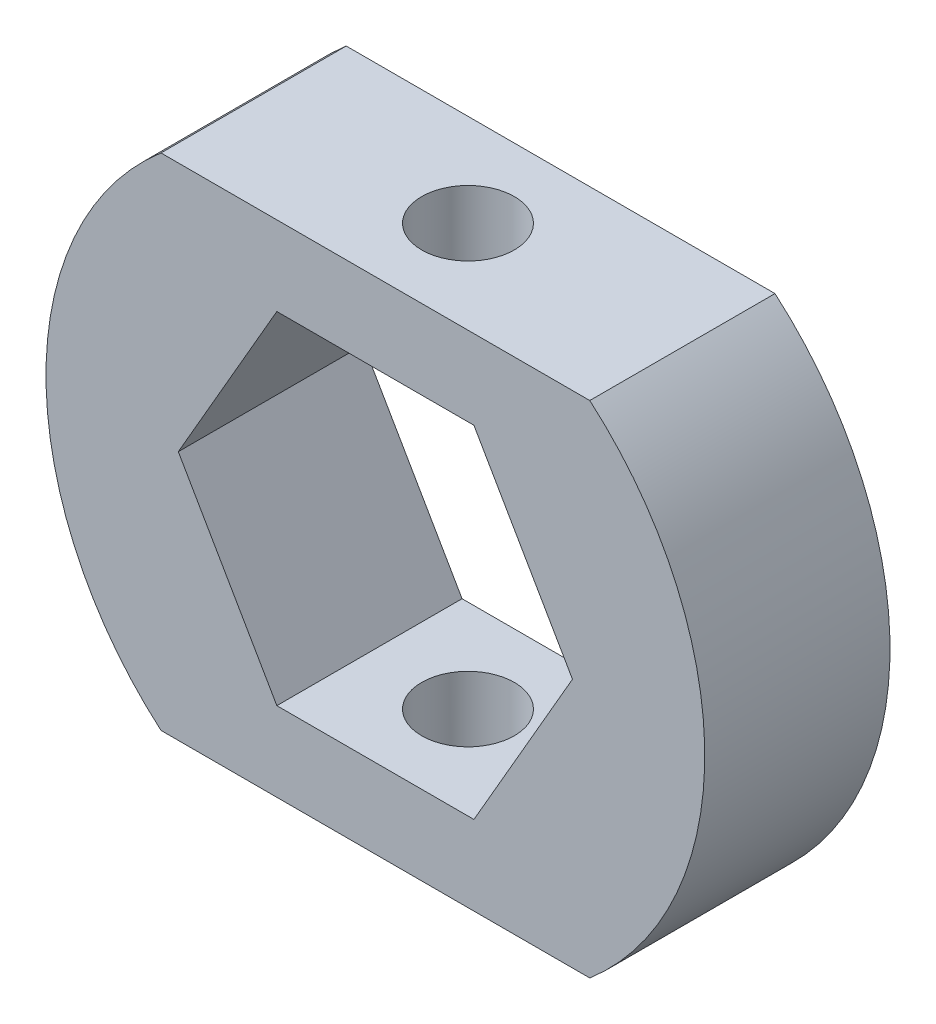
ISO-10303-21;
HEADER;
FILE_DESCRIPTION(('STEP AP214'),'2;1');
FILE_NAME('part.step','',(''),(''),'','','');
FILE_SCHEMA(('AUTOMOTIVE_DESIGN { 1 0 10303 214 1 1 1 1 }'));
ENDSEC;
DATA;
#1=APPLICATION_CONTEXT('core data for automotive mechanical design processes');
#2=APPLICATION_PROTOCOL_DEFINITION('international standard','automotive_design',2000,#1);
#3=PRODUCT_CONTEXT('',#1,'mechanical');
#4=PRODUCT('Part','Part','',(#3));
#5=PRODUCT_RELATED_PRODUCT_CATEGORY('part','',(#4));
#6=PRODUCT_DEFINITION_FORMATION('','',#4);
#7=PRODUCT_DEFINITION_CONTEXT('part definition',#1,'design');
#8=PRODUCT_DEFINITION('design','',#6,#7);
#9=PRODUCT_DEFINITION_SHAPE('','',#8);
#10=(LENGTH_UNIT() NAMED_UNIT(*) SI_UNIT(.MILLI.,.METRE.));
#11=(NAMED_UNIT(*) PLANE_ANGLE_UNIT() SI_UNIT($,.RADIAN.));
#12=(NAMED_UNIT(*) SI_UNIT($,.STERADIAN.) SOLID_ANGLE_UNIT());
#13=UNCERTAINTY_MEASURE_WITH_UNIT(LENGTH_MEASURE(1.E-05),#10,'distance_accuracy_value','');
#14=(GEOMETRIC_REPRESENTATION_CONTEXT(3) GLOBAL_UNCERTAINTY_ASSIGNED_CONTEXT((#13)) GLOBAL_UNIT_ASSIGNED_CONTEXT((#10,
#11,#12)) REPRESENTATION_CONTEXT('',''));
#15=CARTESIAN_POINT('',(0.,0.,0.));
#16=DIRECTION('',(0.,0.,1.));
#17=DIRECTION('',(1.,0.,0.));
#18=AXIS2_PLACEMENT_3D('',#15,#16,#17);
#19=CARTESIAN_POINT('',(0.,0.,3.5));
#20=DIRECTION('',(0.,0.,-1.));
#21=DIRECTION('',(-1.,0.,0.));
#22=AXIS2_PLACEMENT_3D('',#19,#20,#21);
#23=PLANE('',#22);
#24=CARTESIAN_POINT('',(0.,0.,3.5));
#25=DIRECTION('',(0.,0.,1.));
#26=DIRECTION('',(-1.,0.,0.));
#27=AXIS2_PLACEMENT_3D('',#24,#25,#26);
#28=CIRCLE('',#27,12.4478184725462);
#29=CARTESIAN_POINT('',(-8.10220246139663,9.45,3.5));
#30=VERTEX_POINT('',#29);
#31=CARTESIAN_POINT('',(-8.10220246139663,-9.45,3.5));
#32=VERTEX_POINT('',#31);
#33=EDGE_CURVE('E189',#30,#32,#28,.T.);
#34=ORIENTED_EDGE('',*,*,#33,.T.);
#35=DIRECTION('',(1.,0.,0.));
#36=VECTOR('',#35,1.);
#37=CARTESIAN_POINT('',(8.10220246139663,-9.45,3.5));
#38=LINE('',#37,#36);
#39=CARTESIAN_POINT('',(8.10220246139663,-9.45,3.5));
#40=VERTEX_POINT('',#39);
#41=EDGE_CURVE('E193',#32,#40,#38,.T.);
#42=ORIENTED_EDGE('',*,*,#41,.T.);
#43=CARTESIAN_POINT('',(0.,0.,3.5));
#44=DIRECTION('',(0.,0.,1.));
#45=DIRECTION('',(-1.,0.,0.));
#46=AXIS2_PLACEMENT_3D('',#43,#44,#45);
#47=CIRCLE('',#46,12.4478184725462);
#48=CARTESIAN_POINT('',(8.10220246139663,9.45,3.5));
#49=VERTEX_POINT('',#48);
#50=EDGE_CURVE('E197',#40,#49,#47,.T.);
#51=ORIENTED_EDGE('',*,*,#50,.T.);
#52=DIRECTION('',(-1.,0.,0.));
#53=VECTOR('',#52,1.);
#54=CARTESIAN_POINT('',(-8.10220246139663,9.45,3.5));
#55=LINE('',#54,#53);
#56=EDGE_CURVE('E200',#49,#30,#55,.T.);
#57=ORIENTED_EDGE('',*,*,#56,.T.);
#58=EDGE_LOOP('',(#34,#42,#51,#57));
#59=FACE_BOUND('',#58,.T.);
#60=DIRECTION('',(0.499999999999995,0.866025403784442,0.));
#61=VECTOR('',#60,1.);
#62=CARTESIAN_POINT('',(3.72390923627316,-6.44999999999996,3.5));
#63=LINE('',#62,#61);
#64=CARTESIAN_POINT('',(3.72390923627316,-6.44999999999996,3.5));
#65=VERTEX_POINT('',#64);
#66=CARTESIAN_POINT('',(7.44781847254618,0.,3.5));
#67=VERTEX_POINT('',#66);
#68=EDGE_CURVE('E118',#65,#67,#63,.T.);
#69=ORIENTED_EDGE('',*,*,#68,.F.);
#70=DIRECTION('',(1.,0.,0.));
#71=VECTOR('',#70,1.);
#72=CARTESIAN_POINT('',(-3.72390923627303,-6.45000000000004,3.5));
#73=LINE('',#72,#71);
#74=CARTESIAN_POINT('',(-3.72390923627303,-6.45000000000004,3.5));
#75=VERTEX_POINT('',#74);
#76=EDGE_CURVE('E154',#75,#65,#73,.T.);
#77=ORIENTED_EDGE('',*,*,#76,.F.);
#78=DIRECTION('',(0.500000000000007,-0.866025403784434,0.));
#79=VECTOR('',#78,1.);
#80=CARTESIAN_POINT('',(-7.44781847254618,0.,3.5));
#81=LINE('',#80,#79);
#82=CARTESIAN_POINT('',(-7.44781847254618,0.,3.5));
#83=VERTEX_POINT('',#82);
#84=EDGE_CURVE('E151',#83,#75,#81,.T.);
#85=ORIENTED_EDGE('',*,*,#84,.F.);
#86=DIRECTION('',(-0.499999999999995,-0.866025403784442,0.));
#87=VECTOR('',#86,1.);
#88=CARTESIAN_POINT('',(-3.72390923627312,6.44999999999999,3.5));
#89=LINE('',#88,#87);
#90=CARTESIAN_POINT('',(-3.72390923627312,6.44999999999999,3.5));
#91=VERTEX_POINT('',#90);
#92=EDGE_CURVE('E145',#91,#83,#89,.T.);
#93=ORIENTED_EDGE('',*,*,#92,.F.);
#94=DIRECTION('',(-1.,0.,0.));
#95=VECTOR('',#94,1.);
#96=CARTESIAN_POINT('',(3.72390923627307,6.45000000000001,3.5));
#97=LINE('',#96,#95);
#98=CARTESIAN_POINT('',(3.72390923627307,6.45000000000001,3.5));
#99=VERTEX_POINT('',#98);
#100=EDGE_CURVE('E141',#99,#91,#97,.T.);
#101=ORIENTED_EDGE('',*,*,#100,.F.);
#102=DIRECTION('',(-0.500000000000001,0.866025403784438,0.));
#103=VECTOR('',#102,1.);
#104=CARTESIAN_POINT('',(7.44781847254618,0.,3.5));
#105=LINE('',#104,#103);
#106=EDGE_CURVE('E127',#67,#99,#105,.T.);
#107=ORIENTED_EDGE('',*,*,#106,.F.);
#108=EDGE_LOOP('',(#69,#77,#85,#93,#101,#107));
#109=FACE_BOUND('',#108,.T.);
#110=ADVANCED_FACE('F39',(#59,#109),#23,.F.);
#111=CARTESIAN_POINT('',(0.,0.,-3.5));
#112=DIRECTION('',(0.,0.,-1.));
#113=DIRECTION('',(-1.,0.,0.));
#114=AXIS2_PLACEMENT_3D('',#111,#112,#113);
#115=PLANE('',#114);
#116=CARTESIAN_POINT('',(0.,0.,-3.5));
#117=DIRECTION('',(0.,0.,1.));
#118=DIRECTION('',(-1.,0.,0.));
#119=AXIS2_PLACEMENT_3D('',#116,#117,#118);
#120=CIRCLE('',#119,12.4478184725462);
#121=CARTESIAN_POINT('',(-8.10220246139663,9.45,-3.5));
#122=VERTEX_POINT('',#121);
#123=CARTESIAN_POINT('',(-8.10220246139663,-9.45,-3.5));
#124=VERTEX_POINT('',#123);
#125=EDGE_CURVE('E136',#122,#124,#120,.T.);
#126=ORIENTED_EDGE('',*,*,#125,.F.);
#127=DIRECTION('',(-1.,0.,0.));
#128=VECTOR('',#127,1.);
#129=CARTESIAN_POINT('',(-8.10220246139663,9.45,-3.5));
#130=LINE('',#129,#128);
#131=CARTESIAN_POINT('',(8.10220246139663,9.45,-3.5));
#132=VERTEX_POINT('',#131);
#133=EDGE_CURVE('E194',#132,#122,#130,.T.);
#134=ORIENTED_EDGE('',*,*,#133,.F.);
#135=CARTESIAN_POINT('',(0.,0.,-3.5));
#136=DIRECTION('',(0.,0.,1.));
#137=DIRECTION('',(-1.,0.,0.));
#138=AXIS2_PLACEMENT_3D('',#135,#136,#137);
#139=CIRCLE('',#138,12.4478184725462);
#140=CARTESIAN_POINT('',(8.10220246139663,-9.45,-3.5));
#141=VERTEX_POINT('',#140);
#142=EDGE_CURVE('E210',#141,#132,#139,.T.);
#143=ORIENTED_EDGE('',*,*,#142,.F.);
#144=DIRECTION('',(1.,0.,0.));
#145=VECTOR('',#144,1.);
#146=CARTESIAN_POINT('',(8.10220246139663,-9.45,-3.5));
#147=LINE('',#146,#145);
#148=EDGE_CURVE('E207',#124,#141,#147,.T.);
#149=ORIENTED_EDGE('',*,*,#148,.F.);
#150=EDGE_LOOP('',(#126,#134,#143,#149));
#151=FACE_BOUND('',#150,.T.);
#152=DIRECTION('',(1.,0.,0.));
#153=VECTOR('',#152,1.);
#154=CARTESIAN_POINT('',(-3.72390923627303,-6.45000000000004,-3.5));
#155=LINE('',#154,#153);
#156=CARTESIAN_POINT('',(-3.72390923627303,-6.45000000000004,-3.5));
#157=VERTEX_POINT('',#156);
#158=CARTESIAN_POINT('',(3.72390923627316,-6.44999999999996,-3.5));
#159=VERTEX_POINT('',#158);
#160=EDGE_CURVE('E128',#157,#159,#155,.T.);
#161=ORIENTED_EDGE('',*,*,#160,.T.);
#162=DIRECTION('',(0.499999999999995,0.866025403784442,0.));
#163=VECTOR('',#162,1.);
#164=CARTESIAN_POINT('',(3.72390923627316,-6.44999999999996,-3.5));
#165=LINE('',#164,#163);
#166=CARTESIAN_POINT('',(7.44781847254618,0.,-3.5));
#167=VERTEX_POINT('',#166);
#168=EDGE_CURVE('E64',#159,#167,#165,.T.);
#169=ORIENTED_EDGE('',*,*,#168,.T.);
#170=DIRECTION('',(-0.500000000000001,0.866025403784438,0.));
#171=VECTOR('',#170,1.);
#172=CARTESIAN_POINT('',(7.44781847254618,0.,-3.5));
#173=LINE('',#172,#171);
#174=CARTESIAN_POINT('',(3.72390923627307,6.45000000000001,-3.5));
#175=VERTEX_POINT('',#174);
#176=EDGE_CURVE('E134',#167,#175,#173,.T.);
#177=ORIENTED_EDGE('',*,*,#176,.T.);
#178=DIRECTION('',(-1.,0.,0.));
#179=VECTOR('',#178,1.);
#180=CARTESIAN_POINT('',(3.72390923627307,6.45000000000001,-3.5));
#181=LINE('',#180,#179);
#182=CARTESIAN_POINT('',(-3.72390923627312,6.44999999999999,-3.5));
#183=VERTEX_POINT('',#182);
#184=EDGE_CURVE('E162',#175,#183,#181,.T.);
#185=ORIENTED_EDGE('',*,*,#184,.T.);
#186=DIRECTION('',(-0.499999999999995,-0.866025403784442,0.));
#187=VECTOR('',#186,1.);
#188=CARTESIAN_POINT('',(-3.72390923627312,6.44999999999999,-3.5));
#189=LINE('',#188,#187);
#190=CARTESIAN_POINT('',(-7.44781847254618,0.,-3.5));
#191=VERTEX_POINT('',#190);
#192=EDGE_CURVE('E166',#183,#191,#189,.T.);
#193=ORIENTED_EDGE('',*,*,#192,.T.);
#194=DIRECTION('',(0.500000000000007,-0.866025403784434,0.));
#195=VECTOR('',#194,1.);
#196=CARTESIAN_POINT('',(-7.44781847254618,0.,-3.5));
#197=LINE('',#196,#195);
#198=EDGE_CURVE('E170',#191,#157,#197,.T.);
#199=ORIENTED_EDGE('',*,*,#198,.T.);
#200=EDGE_LOOP('',(#161,#169,#177,#185,#193,#199));
#201=FACE_BOUND('',#200,.T.);
#202=ADVANCED_FACE('F234',(#151,#201),#115,.T.);
#203=CARTESIAN_POINT('',(0.,0.,3.5));
#204=DIRECTION('',(0.,0.,-1.));
#205=DIRECTION('',(-1.,0.,0.));
#206=AXIS2_PLACEMENT_3D('',#203,#204,#205);
#207=CYLINDRICAL_SURFACE('',#206,12.4478184725462);
#208=ORIENTED_EDGE('',*,*,#125,.T.);
#209=DIRECTION('',(0.,0.,-1.));
#210=VECTOR('',#209,1.);
#211=CARTESIAN_POINT('',(-8.10220246139663,-9.45,3.5));
#212=LINE('',#211,#210);
#213=EDGE_CURVE('E11',#32,#124,#212,.T.);
#214=ORIENTED_EDGE('',*,*,#213,.F.);
#215=ORIENTED_EDGE('',*,*,#33,.F.);
#216=DIRECTION('',(0.,0.,-1.));
#217=VECTOR('',#216,1.);
#218=CARTESIAN_POINT('',(-8.10220246139663,9.45,3.5));
#219=LINE('',#218,#217);
#220=EDGE_CURVE('E203',#30,#122,#219,.T.);
#221=ORIENTED_EDGE('',*,*,#220,.T.);
#222=EDGE_LOOP('',(#208,#214,#215,#221));
#223=FACE_BOUND('',#222,.T.);
#224=ADVANCED_FACE('F41',(#223),#207,.T.);
#225=CARTESIAN_POINT('',(8.10220246139663,-9.45,3.5));
#226=DIRECTION('',(0.,1.,0.));
#227=DIRECTION('',(0.,0.,1.));
#228=AXIS2_PLACEMENT_3D('',#225,#226,#227);
#229=PLANE('',#228);
#230=CARTESIAN_POINT('',(0.,-9.45,0.));
#231=DIRECTION('',(0.,1.,0.));
#232=DIRECTION('',(0.,0.,1.));
#233=AXIS2_PLACEMENT_3D('',#230,#231,#232);
#234=CIRCLE('',#233,1.75);
#235=CARTESIAN_POINT('',(0.,-9.45,1.75));
#236=VERTEX_POINT('',#235);
#237=EDGE_CURVE('E272',#236,#236,#234,.T.);
#238=ORIENTED_EDGE('',*,*,#237,.T.);
#239=EDGE_LOOP('',(#238));
#240=FACE_BOUND('',#239,.T.);
#241=ORIENTED_EDGE('',*,*,#148,.T.);
#242=DIRECTION('',(0.,0.,-1.));
#243=VECTOR('',#242,1.);
#244=CARTESIAN_POINT('',(8.10220246139663,-9.45,3.5));
#245=LINE('',#244,#243);
#246=EDGE_CURVE('E49',#40,#141,#245,.T.);
#247=ORIENTED_EDGE('',*,*,#246,.F.);
#248=ORIENTED_EDGE('',*,*,#41,.F.);
#249=ORIENTED_EDGE('',*,*,#213,.T.);
#250=EDGE_LOOP('',(#241,#247,#248,#249));
#251=FACE_BOUND('',#250,.T.);
#252=ADVANCED_FACE('F244',(#240,#251),#229,.F.);
#253=CARTESIAN_POINT('',(0.,0.,3.5));
#254=DIRECTION('',(0.,0.,-1.));
#255=DIRECTION('',(-1.,0.,0.));
#256=AXIS2_PLACEMENT_3D('',#253,#254,#255);
#257=CYLINDRICAL_SURFACE('',#256,12.4478184725462);
#258=ORIENTED_EDGE('',*,*,#142,.T.);
#259=DIRECTION('',(0.,0.,-1.));
#260=VECTOR('',#259,1.);
#261=CARTESIAN_POINT('',(8.10220246139663,9.45,3.5));
#262=LINE('',#261,#260);
#263=EDGE_CURVE('E218',#49,#132,#262,.T.);
#264=ORIENTED_EDGE('',*,*,#263,.F.);
#265=ORIENTED_EDGE('',*,*,#50,.F.);
#266=ORIENTED_EDGE('',*,*,#246,.T.);
#267=EDGE_LOOP('',(#258,#264,#265,#266));
#268=FACE_BOUND('',#267,.T.);
#269=ADVANCED_FACE('F228',(#268),#257,.T.);
#270=CARTESIAN_POINT('',(-8.10220246139663,9.45,3.5));
#271=DIRECTION('',(0.,-1.,0.));
#272=DIRECTION('',(0.,0.,-1.));
#273=AXIS2_PLACEMENT_3D('',#270,#271,#272);
#274=PLANE('',#273);
#275=CARTESIAN_POINT('',(0.,9.45,0.));
#276=DIRECTION('',(0.,1.,0.));
#277=DIRECTION('',(0.,0.,1.));
#278=AXIS2_PLACEMENT_3D('',#275,#276,#277);
#279=CIRCLE('',#278,1.75);
#280=CARTESIAN_POINT('',(0.,9.45,1.75));
#281=VERTEX_POINT('',#280);
#282=EDGE_CURVE('E269',#281,#281,#279,.T.);
#283=ORIENTED_EDGE('',*,*,#282,.F.);
#284=EDGE_LOOP('',(#283));
#285=FACE_BOUND('',#284,.T.);
#286=ORIENTED_EDGE('',*,*,#133,.T.);
#287=ORIENTED_EDGE('',*,*,#220,.F.);
#288=ORIENTED_EDGE('',*,*,#56,.F.);
#289=ORIENTED_EDGE('',*,*,#263,.T.);
#290=EDGE_LOOP('',(#286,#287,#288,#289));
#291=FACE_BOUND('',#290,.T.);
#292=ADVANCED_FACE('F238',(#285,#291),#274,.F.);
#293=CARTESIAN_POINT('',(3.72390923627316,-6.44999999999996,3.5));
#294=DIRECTION('',(-0.866025403784442,0.499999999999995,0.));
#295=DIRECTION('',(-0.499999999999995,-0.866025403784442,0.));
#296=AXIS2_PLACEMENT_3D('',#293,#294,#295);
#297=PLANE('',#296);
#298=ORIENTED_EDGE('',*,*,#168,.F.);
#299=DIRECTION('',(0.,0.,-1.));
#300=VECTOR('',#299,1.);
#301=CARTESIAN_POINT('',(3.72390923627316,-6.44999999999996,3.5));
#302=LINE('',#301,#300);
#303=EDGE_CURVE('E122',#65,#159,#302,.T.);
#304=ORIENTED_EDGE('',*,*,#303,.F.);
#305=ORIENTED_EDGE('',*,*,#68,.T.);
#306=DIRECTION('',(0.,0.,-1.));
#307=VECTOR('',#306,1.);
#308=CARTESIAN_POINT('',(7.44781847254618,0.,3.5));
#309=LINE('',#308,#307);
#310=EDGE_CURVE('E121',#67,#167,#309,.T.);
#311=ORIENTED_EDGE('',*,*,#310,.T.);
#312=EDGE_LOOP('',(#298,#304,#305,#311));
#313=FACE_BOUND('',#312,.T.);
#314=ADVANCED_FACE('F120',(#313),#297,.T.);
#315=CARTESIAN_POINT('',(7.44781847254618,0.,3.5));
#316=DIRECTION('',(-0.866025403784438,-0.500000000000001,0.));
#317=DIRECTION('',(0.500000000000001,-0.866025403784438,0.));
#318=AXIS2_PLACEMENT_3D('',#315,#316,#317);
#319=PLANE('',#318);
#320=ORIENTED_EDGE('',*,*,#176,.F.);
#321=ORIENTED_EDGE('',*,*,#310,.F.);
#322=ORIENTED_EDGE('',*,*,#106,.T.);
#323=DIRECTION('',(0.,0.,-1.));
#324=VECTOR('',#323,1.);
#325=CARTESIAN_POINT('',(3.72390923627307,6.45000000000001,3.5));
#326=LINE('',#325,#324);
#327=EDGE_CURVE('E137',#99,#175,#326,.T.);
#328=ORIENTED_EDGE('',*,*,#327,.T.);
#329=EDGE_LOOP('',(#320,#321,#322,#328));
#330=FACE_BOUND('',#329,.T.);
#331=ADVANCED_FACE('F131',(#330),#319,.T.);
#332=CARTESIAN_POINT('',(3.72390923627307,6.45000000000001,3.5));
#333=DIRECTION('',(0.,-1.,0.));
#334=DIRECTION('',(1.,0.,0.));
#335=AXIS2_PLACEMENT_3D('',#332,#333,#334);
#336=PLANE('',#335);
#337=CARTESIAN_POINT('',(0.,6.45,0.));
#338=DIRECTION('',(0.,-1.,0.));
#339=DIRECTION('',(1.,0.,0.));
#340=AXIS2_PLACEMENT_3D('',#337,#338,#339);
#341=CIRCLE('',#340,1.75);
#342=CARTESIAN_POINT('',(1.75,6.45000000000001,0.));
#343=VERTEX_POINT('',#342);
#344=EDGE_CURVE('E159',#343,#343,#341,.T.);
#345=ORIENTED_EDGE('',*,*,#344,.F.);
#346=EDGE_LOOP('',(#345));
#347=FACE_BOUND('',#346,.T.);
#348=ORIENTED_EDGE('',*,*,#184,.F.);
#349=ORIENTED_EDGE('',*,*,#327,.F.);
#350=ORIENTED_EDGE('',*,*,#100,.T.);
#351=DIRECTION('',(0.,0.,-1.));
#352=VECTOR('',#351,1.);
#353=CARTESIAN_POINT('',(-3.72390923627312,6.44999999999999,3.5));
#354=LINE('',#353,#352);
#355=EDGE_CURVE('E184',#91,#183,#354,.T.);
#356=ORIENTED_EDGE('',*,*,#355,.T.);
#357=EDGE_LOOP('',(#348,#349,#350,#356));
#358=FACE_BOUND('',#357,.T.);
#359=ADVANCED_FACE('F301',(#347,#358),#336,.T.);
#360=CARTESIAN_POINT('',(-3.72390923627312,6.44999999999999,3.5));
#361=DIRECTION('',(0.866025403784442,-0.499999999999995,0.));
#362=DIRECTION('',(0.499999999999995,0.866025403784442,0.));
#363=AXIS2_PLACEMENT_3D('',#360,#361,#362);
#364=PLANE('',#363);
#365=ORIENTED_EDGE('',*,*,#192,.F.);
#366=ORIENTED_EDGE('',*,*,#355,.F.);
#367=ORIENTED_EDGE('',*,*,#92,.T.);
#368=DIRECTION('',(0.,0.,-1.));
#369=VECTOR('',#368,1.);
#370=CARTESIAN_POINT('',(-7.44781847254618,0.,3.5));
#371=LINE('',#370,#369);
#372=EDGE_CURVE('E181',#83,#191,#371,.T.);
#373=ORIENTED_EDGE('',*,*,#372,.T.);
#374=EDGE_LOOP('',(#365,#366,#367,#373));
#375=FACE_BOUND('',#374,.T.);
#376=ADVANCED_FACE('F298',(#375),#364,.T.);
#377=CARTESIAN_POINT('',(-7.44781847254618,0.,3.5));
#378=DIRECTION('',(0.866025403784434,0.500000000000007,0.));
#379=DIRECTION('',(-0.500000000000007,0.866025403784435,0.));
#380=AXIS2_PLACEMENT_3D('',#377,#378,#379);
#381=PLANE('',#380);
#382=ORIENTED_EDGE('',*,*,#198,.F.);
#383=ORIENTED_EDGE('',*,*,#372,.F.);
#384=ORIENTED_EDGE('',*,*,#84,.T.);
#385=DIRECTION('',(0.,0.,-1.));
#386=VECTOR('',#385,1.);
#387=CARTESIAN_POINT('',(-3.72390923627303,-6.45000000000004,3.5));
#388=LINE('',#387,#386);
#389=EDGE_CURVE('E56',#75,#157,#388,.T.);
#390=ORIENTED_EDGE('',*,*,#389,.T.);
#391=EDGE_LOOP('',(#382,#383,#384,#390));
#392=FACE_BOUND('',#391,.T.);
#393=ADVANCED_FACE('F289',(#392),#381,.T.);
#394=CARTESIAN_POINT('',(-3.72390923627303,-6.45000000000004,3.5));
#395=DIRECTION('',(0.,1.,0.));
#396=DIRECTION('',(-1.,0.,0.));
#397=AXIS2_PLACEMENT_3D('',#394,#395,#396);
#398=PLANE('',#397);
#399=CARTESIAN_POINT('',(0.,-6.45,0.));
#400=DIRECTION('',(0.,1.,0.));
#401=DIRECTION('',(-1.,0.,0.));
#402=AXIS2_PLACEMENT_3D('',#399,#400,#401);
#403=CIRCLE('',#402,1.75);
#404=CARTESIAN_POINT('',(-1.75,-6.45000000000002,0.));
#405=VERTEX_POINT('',#404);
#406=EDGE_CURVE('E43',#405,#405,#403,.T.);
#407=ORIENTED_EDGE('',*,*,#406,.F.);
#408=EDGE_LOOP('',(#407));
#409=FACE_BOUND('',#408,.T.);
#410=ORIENTED_EDGE('',*,*,#160,.F.);
#411=ORIENTED_EDGE('',*,*,#389,.F.);
#412=ORIENTED_EDGE('',*,*,#76,.T.);
#413=ORIENTED_EDGE('',*,*,#303,.T.);
#414=EDGE_LOOP('',(#410,#411,#412,#413));
#415=FACE_BOUND('',#414,.T.);
#416=ADVANCED_FACE('F287',(#409,#415),#398,.T.);
#417=CARTESIAN_POINT('',(0.,-9.45,0.));
#418=DIRECTION('',(0.,1.,0.));
#419=DIRECTION('',(0.,0.,1.));
#420=AXIS2_PLACEMENT_3D('',#417,#418,#419);
#421=CYLINDRICAL_SURFACE('',#420,1.75);
#422=ORIENTED_EDGE('',*,*,#406,.T.);
#423=EDGE_LOOP('',(#422));
#424=FACE_BOUND('',#423,.T.);
#425=ORIENTED_EDGE('',*,*,#237,.F.);
#426=EDGE_LOOP('',(#425));
#427=FACE_BOUND('',#426,.T.);
#428=ADVANCED_FACE('F284',(#424,#427),#421,.F.);
#429=ORIENTED_EDGE('',*,*,#344,.T.);
#430=EDGE_LOOP('',(#429));
#431=FACE_BOUND('',#430,.T.);
#432=ORIENTED_EDGE('',*,*,#282,.T.);
#433=EDGE_LOOP('',(#432));
#434=FACE_BOUND('',#433,.T.);
#435=ADVANCED_FACE('F314',(#431,#434),#421,.F.);
#436=CLOSED_SHELL('',(#110,#202,#224,#252,#269,#292,#314,#331,#359,#376,#393,#416,#428,#435));
#437=MANIFOLD_SOLID_BREP('B2',#436);
#438=ADVANCED_BREP_SHAPE_REPRESENTATION('',(#18,#437),#14);
#439=SHAPE_DEFINITION_REPRESENTATION(#9,#438);
ENDSEC;
END-ISO-10303-21;
